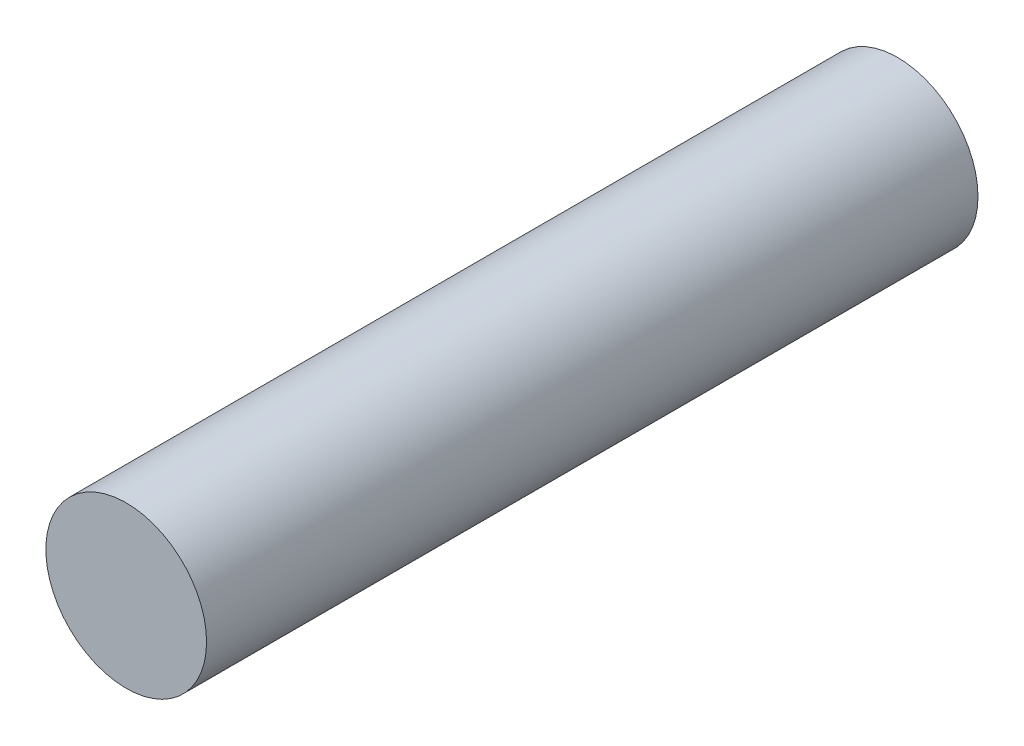
ISO-10303-21;
HEADER;
FILE_DESCRIPTION(('STEP AP214'),'2;1');
FILE_NAME('part.step','',(''),(''),'','','');
FILE_SCHEMA(('AUTOMOTIVE_DESIGN { 1 0 10303 214 1 1 1 1 }'));
ENDSEC;
DATA;
#1=APPLICATION_CONTEXT('core data for automotive mechanical design processes');
#2=APPLICATION_PROTOCOL_DEFINITION('international standard','automotive_design',2000,#1);
#3=PRODUCT_CONTEXT('',#1,'mechanical');
#4=PRODUCT('Part','Part','',(#3));
#5=PRODUCT_RELATED_PRODUCT_CATEGORY('part','',(#4));
#6=PRODUCT_DEFINITION_FORMATION('','',#4);
#7=PRODUCT_DEFINITION_CONTEXT('part definition',#1,'design');
#8=PRODUCT_DEFINITION('design','',#6,#7);
#9=PRODUCT_DEFINITION_SHAPE('','',#8);
#10=(LENGTH_UNIT() NAMED_UNIT(*) SI_UNIT(.MILLI.,.METRE.));
#11=(NAMED_UNIT(*) PLANE_ANGLE_UNIT() SI_UNIT($,.RADIAN.));
#12=(NAMED_UNIT(*) SI_UNIT($,.STERADIAN.) SOLID_ANGLE_UNIT());
#13=UNCERTAINTY_MEASURE_WITH_UNIT(LENGTH_MEASURE(1.E-05),#10,'distance_accuracy_value','');
#14=(GEOMETRIC_REPRESENTATION_CONTEXT(3) GLOBAL_UNCERTAINTY_ASSIGNED_CONTEXT((#13)) GLOBAL_UNIT_ASSIGNED_CONTEXT((#10,
#11,#12)) REPRESENTATION_CONTEXT('',''));
#15=CARTESIAN_POINT('',(0.,0.,0.));
#16=DIRECTION('',(0.,0.,1.));
#17=DIRECTION('',(1.,0.,0.));
#18=AXIS2_PLACEMENT_3D('',#15,#16,#17);
#19=CARTESIAN_POINT('',(0.,0.,72.));
#20=DIRECTION('',(0.,0.,-1.));
#21=DIRECTION('',(-1.,0.,0.));
#22=AXIS2_PLACEMENT_3D('',#19,#20,#21);
#23=CYLINDRICAL_SURFACE('',#22,7.5);
#24=CARTESIAN_POINT('',(0.,0.,72.));
#25=DIRECTION('',(0.,0.,1.));
#26=DIRECTION('',(1.,0.,0.));
#27=AXIS2_PLACEMENT_3D('',#24,#25,#26);
#28=CIRCLE('',#27,7.5);
#29=CARTESIAN_POINT('',(7.5,0.,72.));
#30=VERTEX_POINT('',#29);
#31=EDGE_CURVE('E10',#30,#30,#28,.T.);
#32=ORIENTED_EDGE('',*,*,#31,.F.);
#33=EDGE_LOOP('',(#32));
#34=FACE_BOUND('',#33,.T.);
#35=CARTESIAN_POINT('',(0.,0.,0.));
#36=DIRECTION('',(0.,0.,1.));
#37=DIRECTION('',(1.,0.,0.));
#38=AXIS2_PLACEMENT_3D('',#35,#36,#37);
#39=CIRCLE('',#38,7.5);
#40=CARTESIAN_POINT('',(7.5,0.,0.));
#41=VERTEX_POINT('',#40);
#42=EDGE_CURVE('E46',#41,#41,#39,.T.);
#43=ORIENTED_EDGE('',*,*,#42,.T.);
#44=EDGE_LOOP('',(#43));
#45=FACE_BOUND('',#44,.T.);
#46=ADVANCED_FACE('F43',(#34,#45),#23,.T.);
#47=CARTESIAN_POINT('',(0.,0.,72.));
#48=DIRECTION('',(0.,0.,1.));
#49=DIRECTION('',(1.,0.,0.));
#50=AXIS2_PLACEMENT_3D('',#47,#48,#49);
#51=PLANE('',#50);
#52=ORIENTED_EDGE('',*,*,#31,.T.);
#53=EDGE_LOOP('',(#52));
#54=FACE_BOUND('',#53,.T.);
#55=ADVANCED_FACE('F60',(#54),#51,.T.);
#56=CARTESIAN_POINT('',(0.,0.,0.));
#57=DIRECTION('',(0.,0.,1.));
#58=DIRECTION('',(1.,0.,0.));
#59=AXIS2_PLACEMENT_3D('',#56,#57,#58);
#60=PLANE('',#59);
#61=ORIENTED_EDGE('',*,*,#42,.F.);
#62=EDGE_LOOP('',(#61));
#63=FACE_BOUND('',#62,.T.);
#64=ADVANCED_FACE('F58',(#63),#60,.F.);
#65=CLOSED_SHELL('',(#46,#55,#64));
#66=MANIFOLD_SOLID_BREP('B2',#65);
#67=ADVANCED_BREP_SHAPE_REPRESENTATION('',(#18,#66),#14);
#68=SHAPE_DEFINITION_REPRESENTATION(#9,#67);
ENDSEC;
END-ISO-10303-21;
